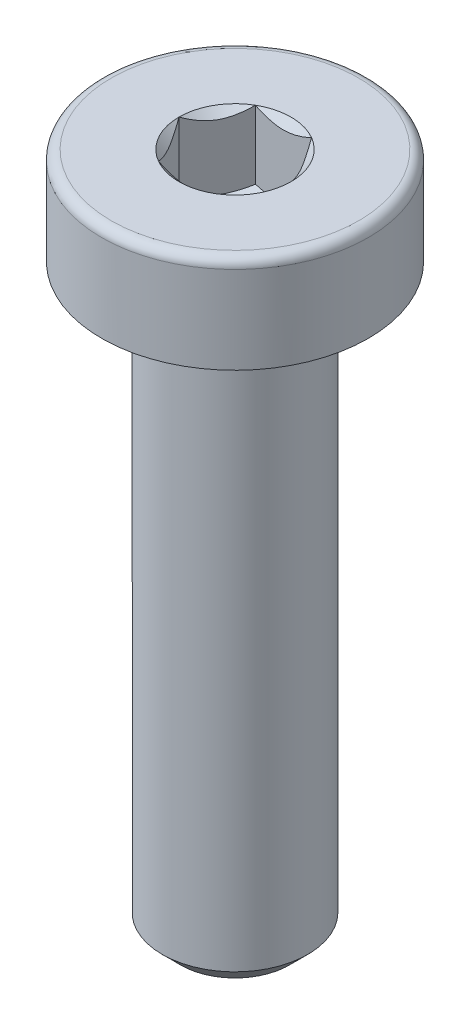
ISO-10303-21;
HEADER;
FILE_DESCRIPTION(('STEP AP214'),'2;1');
FILE_NAME('part.step','',(''),(''),'','','');
FILE_SCHEMA(('AUTOMOTIVE_DESIGN { 1 0 10303 214 1 1 1 1 }'));
ENDSEC;
DATA;
#1=APPLICATION_CONTEXT('core data for automotive mechanical design processes');
#2=APPLICATION_PROTOCOL_DEFINITION('international standard','automotive_design',2000,#1);
#3=PRODUCT_CONTEXT('',#1,'mechanical');
#4=PRODUCT('Part','Part','',(#3));
#5=PRODUCT_RELATED_PRODUCT_CATEGORY('part','',(#4));
#6=PRODUCT_DEFINITION_FORMATION('','',#4);
#7=PRODUCT_DEFINITION_CONTEXT('part definition',#1,'design');
#8=PRODUCT_DEFINITION('design','',#6,#7);
#9=PRODUCT_DEFINITION_SHAPE('','',#8);
#10=(LENGTH_UNIT() NAMED_UNIT(*) SI_UNIT(.MILLI.,.METRE.));
#11=(NAMED_UNIT(*) PLANE_ANGLE_UNIT() SI_UNIT($,.RADIAN.));
#12=(NAMED_UNIT(*) SI_UNIT($,.STERADIAN.) SOLID_ANGLE_UNIT());
#13=UNCERTAINTY_MEASURE_WITH_UNIT(LENGTH_MEASURE(1.E-05),#10,'distance_accuracy_value','');
#14=(GEOMETRIC_REPRESENTATION_CONTEXT(3) GLOBAL_UNCERTAINTY_ASSIGNED_CONTEXT((#13)) GLOBAL_UNIT_ASSIGNED_CONTEXT((#10,
#11,#12)) REPRESENTATION_CONTEXT('',''));
#15=CARTESIAN_POINT('',(0.,0.,0.));
#16=DIRECTION('',(0.,0.,1.));
#17=DIRECTION('',(1.,0.,0.));
#18=AXIS2_PLACEMENT_3D('',#15,#16,#17);
#19=CARTESIAN_POINT('',(0.,-0.2,0.));
#20=DIRECTION('',(0.,1.,0.));
#21=DIRECTION('',(0.,0.,1.));
#22=AXIS2_PLACEMENT_3D('',#19,#20,#21);
#23=TOROIDAL_SURFACE('',#22,1.7,0.2);
#24=CARTESIAN_POINT('',(0.,0.,0.));
#25=DIRECTION('',(0.,1.,0.));
#26=DIRECTION('',(0.,0.,1.));
#27=AXIS2_PLACEMENT_3D('',#24,#25,#26);
#28=CIRCLE('',#27,1.7);
#29=CARTESIAN_POINT('',(0.,0.,1.7));
#30=VERTEX_POINT('',#29);
#31=EDGE_CURVE('E420',#30,#30,#28,.T.);
#32=ORIENTED_EDGE('',*,*,#31,.F.);
#33=EDGE_LOOP('',(#32));
#34=FACE_BOUND('',#33,.T.);
#35=CARTESIAN_POINT('',(0.,-0.2,0.));
#36=DIRECTION('',(0.,-1.,0.));
#37=DIRECTION('',(0.,0.,1.));
#38=AXIS2_PLACEMENT_3D('',#35,#36,#37);
#39=CIRCLE('',#38,1.5);
#40=CARTESIAN_POINT('',(0.,-0.2,1.5));
#41=VERTEX_POINT('',#40);
#42=EDGE_CURVE('E502',#41,#41,#39,.T.);
#43=ORIENTED_EDGE('',*,*,#42,.F.);
#44=EDGE_LOOP('',(#43));
#45=FACE_BOUND('',#44,.T.);
#46=ADVANCED_FACE('F16',(#34,#45),#23,.F.);
#47=CARTESIAN_POINT('',(0.,-12.,0.));
#48=DIRECTION('',(0.,1.,0.));
#49=DIRECTION('',(1.,0.,0.));
#50=AXIS2_PLACEMENT_3D('',#47,#48,#49);
#51=PLANE('',#50);
#52=CARTESIAN_POINT('',(0.,-12.,0.));
#53=DIRECTION('',(0.,-1.,0.));
#54=DIRECTION('',(0.,0.,1.));
#55=AXIS2_PLACEMENT_3D('',#52,#53,#54);
#56=CIRCLE('',#55,1.125);
#57=CARTESIAN_POINT('',(0.,-12.,1.125));
#58=VERTEX_POINT('',#57);
#59=EDGE_CURVE('E10',#58,#58,#56,.T.);
#60=ORIENTED_EDGE('',*,*,#59,.T.);
#61=EDGE_LOOP('',(#60));
#62=FACE_BOUND('',#61,.T.);
#63=ADVANCED_FACE('F273',(#62),#51,.F.);
#64=CARTESIAN_POINT('',(0.,-12.125,0.));
#65=DIRECTION('',(0.,1.,0.));
#66=DIRECTION('',(-1.,0.,0.));
#67=AXIS2_PLACEMENT_3D('',#64,#65,#66);
#68=CONICAL_SURFACE('',#67,1.,0.785398163397448);
#69=ORIENTED_EDGE('',*,*,#59,.F.);
#70=EDGE_LOOP('',(#69));
#71=FACE_BOUND('',#70,.T.);
#72=CARTESIAN_POINT('',(0.,-11.625,0.));
#73=DIRECTION('',(0.,-1.,0.));
#74=DIRECTION('',(-1.,0.,0.));
#75=AXIS2_PLACEMENT_3D('',#72,#73,#74);
#76=CIRCLE('',#75,1.5);
#77=CARTESIAN_POINT('',(-1.5,-11.625,0.));
#78=VERTEX_POINT('',#77);
#79=EDGE_CURVE('E159',#78,#78,#76,.T.);
#80=ORIENTED_EDGE('',*,*,#79,.T.);
#81=EDGE_LOOP('',(#80));
#82=FACE_BOUND('',#81,.T.);
#83=ADVANCED_FACE('F270',(#71,#82),#68,.T.);
#84=CARTESIAN_POINT('',(-1.15470053837925,0.5,0.));
#85=DIRECTION('',(-0.866025403784439,0.,0.5));
#86=DIRECTION('',(0.,1.,0.));
#87=AXIS2_PLACEMENT_3D('',#84,#85,#86);
#88=PLANE('',#87);
#89=CARTESIAN_POINT('',(-1.15470053837925,2.,0.));
#90=CARTESIAN_POINT('',(-1.00117078125086,1.84647024287162,0.265921339820074));
#91=CARTESIAN_POINT('',(-0.867089249093141,1.84530172515184,0.498157365873931));
#92=CARTESIAN_POINT('',(-0.733215253083504,1.8441350161052,0.730033928774895));
#93=CARTESIAN_POINT('',(-0.57735026918948,1.99999999999927,1.00000000000025));
#94=B_SPLINE_CURVE_WITH_KNOTS('',2,(#89,#90,#91,#92,#93),.UNSPECIFIED.,.F.,.F.,(3,2,3),(0.,0.5,
1.),.UNSPECIFIED.);
#95=CARTESIAN_POINT('',(-1.15470053837925,2.,0.));
#96=VERTEX_POINT('',#95);
#97=CARTESIAN_POINT('',(-0.577350269189626,2.,1.));
#98=VERTEX_POINT('',#97);
#99=EDGE_CURVE('E416',#96,#98,#94,.T.);
#100=ORIENTED_EDGE('',*,*,#99,.T.);
#101=DIRECTION('',(0.,1.,0.));
#102=VECTOR('',#101,1.);
#103=CARTESIAN_POINT('',(-0.577350269189626,0.5,1.));
#104=LINE('',#103,#102);
#105=CARTESIAN_POINT('',(-0.577350269189626,0.589316397477042,1.));
#106=VERTEX_POINT('',#105);
#107=EDGE_CURVE('E143',#106,#98,#104,.T.);
#108=ORIENTED_EDGE('',*,*,#107,.F.);
#109=CARTESIAN_POINT('',(-1.15470053837925,0.589316397477043,0.));
#110=CARTESIAN_POINT('',(-1.1422776254852,0.582145061548454,0.021515887063845));
#111=CARTESIAN_POINT('',(-1.12980572440145,0.575290529962869,0.0431130815008311));
#112=CARTESIAN_POINT('',(-1.10516877386456,0.562518070323557,0.0858404042081745));
#113=CARTESIAN_POINT('',(-1.09300571707735,0.556578244850613,0.106965156736799));
#114=CARTESIAN_POINT('',(-1.06894241920652,0.545632531934319,0.148883907199831));
#115=CARTESIAN_POINT('',(-1.05704304561731,0.540607317583832,0.169673316642415));
#116=CARTESIAN_POINT('',(-1.03344126715609,0.531488117613305,0.211063578718422));
#117=CARTESIAN_POINT('',(-1.02173909837023,0.527379242171332,0.231661269176965));
#118=CARTESIAN_POINT('',(-0.998439619296902,0.520087570224119,0.272815704232481));
#119=CARTESIAN_POINT('',(-0.986842367431211,0.516896357949622,0.293370983478975));
#120=CARTESIAN_POINT('',(-0.963630649649038,0.511432897740972,0.33458880079611));
#121=CARTESIAN_POINT('',(-0.952016187375457,0.509160477291832,0.355251317992815));
#122=CARTESIAN_POINT('',(-0.928615137972573,0.505525933544308,0.396828053797181));
#123=CARTESIAN_POINT('',(-0.916827980653532,0.504172969622274,0.41774275139525));
#124=CARTESIAN_POINT('',(-0.892891053471395,0.502367479696766,0.459958305071784));
#125=CARTESIAN_POINT('',(-0.88073874884194,0.501933526563364,0.481258507610898));
#126=CARTESIAN_POINT('',(-0.856257235695783,0.501957698326459,0.523654214585648));
#127=CARTESIAN_POINT('',(-0.843928822248721,0.502412614939665,0.544750180023796));
#128=CARTESIAN_POINT('',(-0.819420681665752,0.504253995001974,0.586439287846091));
#129=CARTESIAN_POINT('',(-0.80724270276635,0.505622235893781,0.607034252182705));
#130=CARTESIAN_POINT('',(-0.783017066755103,0.509280885955065,0.647952632793485));
#131=CARTESIAN_POINT('',(-0.770969274303699,0.511562376898162,0.668276765739735));
#132=CARTESIAN_POINT('',(-0.746956492541301,0.51703779791969,0.708859066345339));
#133=CARTESIAN_POINT('',(-0.734991529583474,0.520232005852064,0.729117212014218));
#134=CARTESIAN_POINT('',(-0.711075209617807,0.527523596594688,0.769746807127452));
#135=CARTESIAN_POINT('',(-0.699125090769733,0.531629372272877,0.790117471798635));
#136=CARTESIAN_POINT('',(-0.675154824355723,0.540736433878131,0.831125976310756));
#137=CARTESIAN_POINT('',(-0.663137276162293,0.545752483880906,0.851762040669467));
#138=CARTESIAN_POINT('',(-0.638941132936142,0.556674024791821,0.893430606128303));
#139=CARTESIAN_POINT('',(-0.626766044340648,0.562598648059455,0.914460089337463));
#140=CARTESIAN_POINT('',(-0.602159683115032,0.575334898103387,0.957023431622116));
#141=CARTESIAN_POINT('',(-0.58973203881774,0.582168191432241,0.978552925679333));
#142=CARTESIAN_POINT('',(-0.57735026918962,0.589316397477036,0.999999999999998));
#143=B_SPLINE_CURVE_WITH_KNOTS('',3,(#109,#110,#111,#112,#113,#114,#115,#116,#117,#118,#119,
#120,#121,#122,#123,#124,#125,#126,#127,#128,#129,#130,#131,#132,#133,#134,#135,#136,#137,#138,
#139,#140,#141,#142),.UNSPECIFIED.,.F.,.F.,(4,2,2,2,2,2,2,2,2,2,2,2,2,2,2,2,4),(0.,
0.0775799336285172,0.15283713344211,0.226249266739255,0.298363815314992,0.369794224205565,
0.441211214882481,0.51332960442225,0.586892093802747,0.66018955743096,0.732066645944519,
0.803258313913417,0.8744716775434,0.946370107950428,1.01956032219192,1.09458388807375,
1.17191346643988),.UNSPECIFIED.);
#144=CARTESIAN_POINT('',(-1.15470053837925,0.589316397477044,0.));
#145=VERTEX_POINT('',#144);
#146=EDGE_CURVE('E139',#145,#106,#143,.T.);
#147=ORIENTED_EDGE('',*,*,#146,.F.);
#148=DIRECTION('',(0.,1.,0.));
#149=VECTOR('',#148,1.);
#150=CARTESIAN_POINT('',(-1.15470053837925,0.5,0.));
#151=LINE('',#150,#149);
#152=EDGE_CURVE('E29',#145,#96,#151,.T.);
#153=ORIENTED_EDGE('',*,*,#152,.T.);
#154=EDGE_LOOP('',(#100,#108,#147,#153));
#155=FACE_BOUND('',#154,.T.);
#156=ADVANCED_FACE('F141',(#155),#88,.F.);
#157=CARTESIAN_POINT('',(-0.577350269189624,0.5,-1.));
#158=DIRECTION('',(-0.866025403784438,0.,-0.5));
#159=DIRECTION('',(-0.5,0.,0.866025403784438));
#160=AXIS2_PLACEMENT_3D('',#157,#158,#159);
#161=PLANE('',#160);
#162=CARTESIAN_POINT('',(-0.577350269189625,2.,-0.999999999999998));
#163=CARTESIAN_POINT('',(-0.730880026318,1.84647024287162,-0.734078660179944));
#164=CARTESIAN_POINT('',(-0.864961558475733,1.84530172515184,-0.501842634126069));
#165=CARTESIAN_POINT('',(-0.998835554485382,1.8441350161052,-0.269966071225084));
#166=CARTESIAN_POINT('',(-1.15470053837939,1.99999999999928,2.43945488809238E-13));
#167=B_SPLINE_CURVE_WITH_KNOTS('',2,(#162,#163,#164,#165,#166),.UNSPECIFIED.,.F.,.F.,(3,2,3),
(0.,0.5,1.),.UNSPECIFIED.);
#168=CARTESIAN_POINT('',(-0.577350269189625,2.,-1.));
#169=VERTEX_POINT('',#168);
#170=EDGE_CURVE('E130',#169,#96,#167,.T.);
#171=ORIENTED_EDGE('',*,*,#170,.T.);
#172=ORIENTED_EDGE('',*,*,#152,.F.);
#173=CARTESIAN_POINT('',(-0.577350269189627,0.589316397477045,-1.));
#174=CARTESIAN_POINT('',(-0.589772117524805,0.582145061548479,-0.978483498312897));
#175=CARTESIAN_POINT('',(-0.602239886015797,0.575290529962917,-0.956883917922458));
#176=CARTESIAN_POINT('',(-0.626924357647565,0.562518070323645,-0.914184031532187));
#177=CARTESIAN_POINT('',(-0.639137401592391,0.556578244850719,-0.893088139102523));
#178=CARTESIAN_POINT('',(-0.663408455452852,0.54563253193445,-0.851289336616123));
#179=CARTESIAN_POINT('',(-0.675462925365203,0.540607317583974,-0.830589472077488));
#180=CARTESIAN_POINT('',(-0.699507054561722,0.53148811761346,-0.789454601317619));
#181=CARTESIAN_POINT('',(-0.711494093365185,0.527379242171491,-0.769021380640425));
#182=CARTESIAN_POINT('',(-0.735485140065021,0.520087570224278,-0.728266222340228));
#183=CARTESIAN_POINT('',(-0.747487908141538,0.516896357949778,-0.707945067987197));
#184=CARTESIAN_POINT('',(-0.771577726135665,0.511432897741115,-0.667234222063753));
#185=CARTESIAN_POINT('',(-0.783664759797369,0.509160477291966,-0.646844544085154));
#186=CARTESIAN_POINT('',(-0.807970744508966,0.505525933544416,-0.605790272924778));
#187=CARTESIAN_POINT('',(-0.820189825281854,0.504172969622366,-0.585124946448999));
#188=CARTESIAN_POINT('',(-0.844781103609498,0.502367479696817,-0.54328718258234));
#189=CARTESIAN_POINT('',(-0.857151467799394,0.501933526563389,-0.522112876789074));
#190=CARTESIAN_POINT('',(-0.881626470477781,0.501957698326439,-0.479713410994005));
#191=CARTESIAN_POINT('',(-0.89373190574098,0.50241261493962,-0.458488709041452));
#192=CARTESIAN_POINT('',(-0.917581661884609,0.504253995001887,-0.416419482786004));
#193=CARTESIAN_POINT('',(-0.929328434740412,0.505622235893679,-0.395575561524098));
#194=CARTESIAN_POINT('',(-0.952651973825387,0.509280885954937,-0.354136355010195));
#195=CARTESIAN_POINT('',(-0.964229293041011,0.511562376898024,-0.333540594214658));
#196=CARTESIAN_POINT('',(-0.987368205428263,0.517037797919539,-0.292453764890132));
#197=CARTESIAN_POINT('',(-0.998929792732163,0.52023200585191,-0.271962730178892));
#198=CARTESIAN_POINT('',(-1.02215789426288,0.527523596594534,-0.230935791966992));
#199=CARTESIAN_POINT('',(-1.03382434793608,0.531629372272727,-0.210401353130728));
#200=CARTESIAN_POINT('',(-1.05735362140782,0.540736433877994,-0.169138241224641));
#201=CARTESIAN_POINT('',(-1.06921620327991,0.54575248388078,-0.148412707018555));
#202=CARTESIAN_POINT('',(-1.09320416789351,0.55667402479172,-0.106623949581629));
#203=CARTESIAN_POINT('',(-1.10532869028339,0.562598648059372,-0.0855652719599876));
#204=CARTESIAN_POINT('',(-1.12988644535915,0.575334898103344,-0.0429738669014798));
#205=CARTESIAN_POINT('',(-1.14231771199472,0.58216819143222,-0.0214464642021553));
#206=CARTESIAN_POINT('',(-1.15470053837925,0.589316397477038,0.));
#207=B_SPLINE_CURVE_WITH_KNOTS('',3,(#173,#174,#175,#176,#177,#178,#179,#180,#181,#182,#183,
#184,#185,#186,#187,#188,#189,#190,#191,#192,#193,#194,#195,#196,#197,#198,#199,#200,#201,#202,
#203,#204,#205,#206),.UNSPECIFIED.,.F.,.F.,(4,2,2,2,2,2,2,2,2,2,2,2,2,2,2,2,4),(0.,
0.0775799336282744,0.152837133441706,0.226249266738765,0.298363815314486,0.369794224205106,
0.441211214882123,0.513329604422042,0.586892093802727,0.660189557430751,0.73206664594416,
0.803258313912957,0.874471677542892,0.946370107949937,1.01956032219152,1.09458388807351,
1.17191346643989),.UNSPECIFIED.);
#208=CARTESIAN_POINT('',(-0.577350269189625,0.589316397477047,-1.));
#209=VERTEX_POINT('',#208);
#210=EDGE_CURVE('E128',#209,#145,#207,.T.);
#211=ORIENTED_EDGE('',*,*,#210,.F.);
#212=DIRECTION('',(0.,1.,0.));
#213=VECTOR('',#212,1.);
#214=CARTESIAN_POINT('',(-0.577350269189625,0.5,-1.));
#215=LINE('',#214,#213);
#216=EDGE_CURVE('E136',#209,#169,#215,.T.);
#217=ORIENTED_EDGE('',*,*,#216,.T.);
#218=EDGE_LOOP('',(#171,#172,#211,#217));
#219=FACE_BOUND('',#218,.T.);
#220=ADVANCED_FACE('F18',(#219),#161,.F.);
#221=CARTESIAN_POINT('',(0.577350269189628,0.5,-1.));
#222=DIRECTION('',(0.,0.,-1.));
#223=DIRECTION('',(0.,-1.,0.));
#224=AXIS2_PLACEMENT_3D('',#221,#222,#223);
#225=PLANE('',#224);
#226=CARTESIAN_POINT('',(0.577350269189625,2.,-1.));
#227=CARTESIAN_POINT('',(0.270060534721078,1.84635513276574,-1.));
#228=CARTESIAN_POINT('',(0.000495609398556127,1.84529958443508,-1.));
#229=CARTESIAN_POINT('',(-0.265863448139593,1.84425658947496,-1.));
#230=CARTESIAN_POINT('',(-0.577350269189632,2.,-1.));
#231=B_SPLINE_CURVE_WITH_KNOTS('',2,(#226,#227,#228,#229,#230),.UNSPECIFIED.,.F.,.F.,(3,2,3),
(0.,0.5,1.),.UNSPECIFIED.);
#232=CARTESIAN_POINT('',(0.577350269189628,2.,-1.));
#233=VERTEX_POINT('',#232);
#234=EDGE_CURVE('E345',#233,#169,#231,.T.);
#235=ORIENTED_EDGE('',*,*,#234,.T.);
#236=ORIENTED_EDGE('',*,*,#216,.F.);
#237=CARTESIAN_POINT('',(0.577350269189629,0.589316397477046,-1.));
#238=CARTESIAN_POINT('',(0.552505507960357,0.582145061548458,-0.999999385376672));
#239=CARTESIAN_POINT('',(0.527565838385578,0.575290529962872,-0.999996999423149));
#240=CARTESIAN_POINT('',(0.47824441621688,0.56251807032356,-1.0000244357401));
#241=CARTESIAN_POINT('',(0.453868315484823,0.556578244850616,-1.00005329583901));
#242=CARTESIAN_POINT('',(0.405533963753522,0.545632531934322,-1.00017324381556));
#243=CARTESIAN_POINT('',(0.381580120251964,0.540607317583835,-1.00026278871947));
#244=CARTESIAN_POINT('',(0.333934212594235,0.531488117613308,-1.00051818003557));
#245=CARTESIAN_POINT('',(0.310245005004916,0.527379242171335,-1.00068264981691));
#246=CARTESIAN_POINT('',(0.262954479231781,0.520087570224122,-1.00108192657222));
#247=CARTESIAN_POINT('',(0.239354459289589,0.516896357949625,-1.00131605146569));
#248=CARTESIAN_POINT('',(0.192052923513318,0.511432897740975,-1.00182302285942));
#249=CARTESIAN_POINT('',(0.168351427578049,0.509160477291835,-1.00209586207756));
#250=CARTESIAN_POINT('',(0.120644393463594,0.505525933544311,-1.00261832672163));
#251=CARTESIAN_POINT('',(0.0966381553716762,0.504172969622278,-1.00286769784397));
#252=CARTESIAN_POINT('',(0.0481099498619062,0.50236747969677,-1.00324548765397));
#253=CARTESIAN_POINT('',(0.023587281042553,0.501933526563368,-1.00337138439989));
#254=CARTESIAN_POINT('',(-0.0253692347820597,0.501957698326463,-1.00336762557961));
#255=CARTESIAN_POINT('',(-0.0498030834923871,0.502412614939669,-1.00323888906517));
#256=CARTESIAN_POINT('',(-0.0981609802190884,0.504253995001978,-1.00285877063195));
#257=CARTESIAN_POINT('',(-0.122085731974333,0.505622235893786,-1.00260981370662));
#258=CARTESIAN_POINT('',(-0.169634907070614,0.509280885955069,-1.00208898780344));
#259=CARTESIAN_POINT('',(-0.193260018737662,0.511562376898166,-1.00181735995412));
#260=CARTESIAN_POINT('',(-0.240411712887332,0.517037797919695,-1.00131283123516));
#261=CARTESIAN_POINT('',(-0.26393826314906,0.520232005852068,-1.00107994219278));
#262=CARTESIAN_POINT('',(-0.31108268464543,0.527523596594693,-1.00068259909409));
#263=CARTESIAN_POINT('',(-0.334699257166686,0.531629372272882,-1.00051882492901));
#264=CARTESIAN_POINT('',(-0.382198797052396,0.540736433878136,-1.00026421753506));
#265=CARTESIAN_POINT('',(-0.406078927117886,0.545752483880911,-1.0001747476877));
#266=CARTESIAN_POINT('',(-0.454263034957568,0.556674024791826,-1.00005455570966));
#267=CARTESIAN_POINT('',(-0.478562645942905,0.56259864805946,-1.00002536129722));
#268=CARTESIAN_POINT('',(-0.527726762244194,0.575334898103392,-0.999997298523466));
#269=CARTESIAN_POINT('',(-0.552585673177015,0.582168191432246,-0.999999389881423));
#270=CARTESIAN_POINT('',(-0.577350269189624,0.589316397477041,-0.999999999999998));
#271=B_SPLINE_CURVE_WITH_KNOTS('',3,(#237,#238,#239,#240,#241,#242,#243,#244,#245,#246,#247,
#248,#249,#250,#251,#252,#253,#254,#255,#256,#257,#258,#259,#260,#261,#262,#263,#264,#265,#266,
#267,#268,#269,#270),.UNSPECIFIED.,.F.,.F.,(4,2,2,2,2,2,2,2,2,2,2,2,2,2,2,2,4),(0.,
0.0775799336285192,0.152837133442114,0.22624926673926,0.298363815314997,0.369794224205569,
0.441211214882483,0.513329604422249,0.586892093802744,0.660189557430959,0.732066645944521,
0.803258313913422,0.874471677543404,0.946370107950433,1.01956032219193,1.09458388807376,
1.17191346643988),.UNSPECIFIED.);
#272=CARTESIAN_POINT('',(0.577350269189628,0.589316397477047,-1.));
#273=VERTEX_POINT('',#272);
#274=EDGE_CURVE('E156',#273,#209,#271,.T.);
#275=ORIENTED_EDGE('',*,*,#274,.F.);
#276=DIRECTION('',(0.,1.,0.));
#277=VECTOR('',#276,1.);
#278=CARTESIAN_POINT('',(0.577350269189628,0.5,-1.));
#279=LINE('',#278,#277);
#280=EDGE_CURVE('E89',#273,#233,#279,.T.);
#281=ORIENTED_EDGE('',*,*,#280,.T.);
#282=EDGE_LOOP('',(#235,#236,#275,#281));
#283=FACE_BOUND('',#282,.T.);
#284=ADVANCED_FACE('F182',(#283),#225,.F.);
#285=CARTESIAN_POINT('',(1.15470053837925,0.5,0.));
#286=DIRECTION('',(0.866025403784439,0.,-0.5));
#287=DIRECTION('',(0.,-1.,0.));
#288=AXIS2_PLACEMENT_3D('',#285,#286,#287);
#289=PLANE('',#288);
#290=CARTESIAN_POINT('',(1.15470053837925,2.,0.));
#291=CARTESIAN_POINT('',(1.00117078125086,1.84647024287162,-0.265921339820078));
#292=CARTESIAN_POINT('',(0.867089249093142,1.84530172515184,-0.498157365873931));
#293=CARTESIAN_POINT('',(0.733215253083495,1.84413501610522,-0.730033928774914));
#294=CARTESIAN_POINT('',(0.577350269189482,1.99999999999929,-1.00000000000025));
#295=B_SPLINE_CURVE_WITH_KNOTS('',2,(#290,#291,#292,#293,#294),.UNSPECIFIED.,.F.,.F.,(3,2,3),
(0.,0.5,1.),.UNSPECIFIED.);
#296=CARTESIAN_POINT('',(1.15470053837925,2.,0.));
#297=VERTEX_POINT('',#296);
#298=EDGE_CURVE('E432',#297,#233,#295,.T.);
#299=ORIENTED_EDGE('',*,*,#298,.T.);
#300=ORIENTED_EDGE('',*,*,#280,.F.);
#301=CARTESIAN_POINT('',(1.15470053837925,0.589316397477043,0.));
#302=CARTESIAN_POINT('',(1.1422776254852,0.582145061548455,-0.0215158870638419));
#303=CARTESIAN_POINT('',(1.12980572440145,0.575290529962869,-0.0431130815008281));
#304=CARTESIAN_POINT('',(1.10516877386457,0.562518070323558,-0.0858404042081722));
#305=CARTESIAN_POINT('',(1.09300571707735,0.556578244850615,-0.106965156736797));
#306=CARTESIAN_POINT('',(1.06894241920652,0.545632531934321,-0.148883907199829));
#307=CARTESIAN_POINT('',(1.05704304561732,0.540607317583834,-0.169673316642413));
#308=CARTESIAN_POINT('',(1.03344126715609,0.531488117613307,-0.211063578718421));
#309=CARTESIAN_POINT('',(1.02173909837023,0.527379242171335,-0.231661269176964));
#310=CARTESIAN_POINT('',(0.998439619296906,0.520087570224122,-0.272815704232479));
#311=CARTESIAN_POINT('',(0.986842367431215,0.516896357949625,-0.293370983478973));
#312=CARTESIAN_POINT('',(0.963630649649042,0.511432897740975,-0.334588800796107));
#313=CARTESIAN_POINT('',(0.952016187375462,0.509160477291835,-0.355251317992812));
#314=CARTESIAN_POINT('',(0.928615137972578,0.505525933544311,-0.396828053797177));
#315=CARTESIAN_POINT('',(0.916827980653537,0.504172969622278,-0.417742751395246));
#316=CARTESIAN_POINT('',(0.892891053471401,0.50236747969677,-0.459958305071779));
#317=CARTESIAN_POINT('',(0.880738748841946,0.501933526563367,-0.481258507610893));
#318=CARTESIAN_POINT('',(0.856257235695789,0.501957698326462,-0.523654214585642));
#319=CARTESIAN_POINT('',(0.843928822248727,0.502412614939669,-0.54475018002379));
#320=CARTESIAN_POINT('',(0.819420681665758,0.504253995001977,-0.586439287846085));
#321=CARTESIAN_POINT('',(0.807242702766356,0.505622235893785,-0.6070342521827));
#322=CARTESIAN_POINT('',(0.783017066755108,0.509280885955068,-0.64795263279348));
#323=CARTESIAN_POINT('',(0.770969274303704,0.511562376898166,-0.66827676573973));
#324=CARTESIAN_POINT('',(0.746956492541306,0.517037797919694,-0.708859066345335));
#325=CARTESIAN_POINT('',(0.734991529583479,0.520232005852067,-0.729117212014214));
#326=CARTESIAN_POINT('',(0.711075209617813,0.527523596594692,-0.769746807127448));
#327=CARTESIAN_POINT('',(0.699125090769738,0.531629372272881,-0.790117471798631));
#328=CARTESIAN_POINT('',(0.675154824355728,0.540736433878135,-0.831125976310752));
#329=CARTESIAN_POINT('',(0.663137276162299,0.545752483880911,-0.851762040669464));
#330=CARTESIAN_POINT('',(0.638941132936147,0.556674024791825,-0.8934306061283));
#331=CARTESIAN_POINT('',(0.626766044340653,0.562598648059459,-0.91446008933746));
#332=CARTESIAN_POINT('',(0.602159683115038,0.575334898103392,-0.957023431622114));
#333=CARTESIAN_POINT('',(0.589732038817745,0.582168191432245,-0.978552925679331));
#334=CARTESIAN_POINT('',(0.577350269189625,0.589316397477041,-0.999999999999997));
#335=B_SPLINE_CURVE_WITH_KNOTS('',3,(#301,#302,#303,#304,#305,#306,#307,#308,#309,#310,#311,
#312,#313,#314,#315,#316,#317,#318,#319,#320,#321,#322,#323,#324,#325,#326,#327,#328,#329,#330,
#331,#332,#333,#334),.UNSPECIFIED.,.F.,.F.,(4,2,2,2,2,2,2,2,2,2,2,2,2,2,2,2,4),(0.,
0.0775799336285166,0.15283713344211,0.226249266739254,0.298363815314991,0.369794224205563,
0.441211214882478,0.513329604422245,0.586892093802741,0.660189557430954,0.732066645944514,
0.803258313913414,0.874471677543396,0.946370107950424,1.01956032219192,1.09458388807375,
1.17191346643988),.UNSPECIFIED.);
#336=CARTESIAN_POINT('',(1.15470053837925,0.589316397477045,0.));
#337=VERTEX_POINT('',#336);
#338=EDGE_CURVE('E405',#337,#273,#335,.T.);
#339=ORIENTED_EDGE('',*,*,#338,.F.);
#340=DIRECTION('',(0.,1.,0.));
#341=VECTOR('',#340,1.);
#342=CARTESIAN_POINT('',(1.15470053837925,0.5,0.));
#343=LINE('',#342,#341);
#344=EDGE_CURVE('E104',#337,#297,#343,.T.);
#345=ORIENTED_EDGE('',*,*,#344,.T.);
#346=EDGE_LOOP('',(#299,#300,#339,#345));
#347=FACE_BOUND('',#346,.T.);
#348=ADVANCED_FACE('F381',(#347),#289,.F.);
#349=CARTESIAN_POINT('',(0.577350269189626,0.5,1.));
#350=DIRECTION('',(0.866025403784439,0.,0.5));
#351=DIRECTION('',(0.,-1.,0.));
#352=AXIS2_PLACEMENT_3D('',#349,#350,#351);
#353=PLANE('',#352);
#354=CARTESIAN_POINT('',(0.577350269189625,2.,1.));
#355=CARTESIAN_POINT('',(0.730880026318006,1.84647024287162,0.734078660179936));
#356=CARTESIAN_POINT('',(0.864961558475735,1.84530172515183,0.501842634126069));
#357=CARTESIAN_POINT('',(0.998835554485375,1.8441350161052,0.269966071225099));
#358=CARTESIAN_POINT('',(1.1547005383794,1.99999999999928,-2.51968584885631E-13));
#359=B_SPLINE_CURVE_WITH_KNOTS('',2,(#354,#355,#356,#357,#358),.UNSPECIFIED.,.F.,.F.,(3,2,3),
(0.,0.5,1.),.UNSPECIFIED.);
#360=CARTESIAN_POINT('',(0.577350269189626,2.,1.));
#361=VERTEX_POINT('',#360);
#362=EDGE_CURVE('E315',#361,#297,#359,.T.);
#363=ORIENTED_EDGE('',*,*,#362,.T.);
#364=ORIENTED_EDGE('',*,*,#344,.F.);
#365=CARTESIAN_POINT('',(0.577350269189629,0.589316397477041,1.));
#366=CARTESIAN_POINT('',(0.589772117524845,0.582145061548453,0.97848349831283));
#367=CARTESIAN_POINT('',(0.602239886015871,0.575290529962867,0.95688391792232));
#368=CARTESIAN_POINT('',(0.626924357647685,0.562518070323555,0.914184031531926));
#369=CARTESIAN_POINT('',(0.639137401592525,0.556578244850612,0.893088139102211));
#370=CARTESIAN_POINT('',(0.663408455452999,0.545632531934318,0.851289336615727));
#371=CARTESIAN_POINT('',(0.675462925365349,0.540607317583831,0.83058947207706));
#372=CARTESIAN_POINT('',(0.699507054561857,0.531488117613304,0.789454601317146));
#373=CARTESIAN_POINT('',(0.71149409336531,0.527379242171332,0.769021380639941));
#374=CARTESIAN_POINT('',(0.735485140065122,0.520087570224119,0.728266222339741));
#375=CARTESIAN_POINT('',(0.747487908141624,0.516896357949621,0.70794506798672));
#376=CARTESIAN_POINT('',(0.771577726135722,0.511432897740971,0.667234222063315));
#377=CARTESIAN_POINT('',(0.783664759797411,0.509160477291832,0.646844544084746));
#378=CARTESIAN_POINT('',(0.807970744508983,0.505525933544308,0.605790272924451));
#379=CARTESIAN_POINT('',(0.82018982528186,0.504172969622274,0.585124946448723));
#380=CARTESIAN_POINT('',(0.844781103609495,0.502367479696766,0.543287182582189));
#381=CARTESIAN_POINT('',(0.857151467799393,0.501933526563364,0.522112876788997));
#382=CARTESIAN_POINT('',(0.881626470477849,0.501957698326459,0.479713410993967));
#383=CARTESIAN_POINT('',(0.893731905741113,0.502412614939665,0.458488709041379));
#384=CARTESIAN_POINT('',(0.917581661884845,0.504253995001974,0.41641948278586));
#385=CARTESIAN_POINT('',(0.929328434740686,0.505622235893782,0.395575561523919));
#386=CARTESIAN_POINT('',(0.952651973825719,0.509280885955065,0.354136355009953));
#387=CARTESIAN_POINT('',(0.964229293041362,0.511562376898163,0.333540594214389));
#388=CARTESIAN_POINT('',(0.987368205428633,0.517037797919691,0.292453764889818));
#389=CARTESIAN_POINT('',(0.998929792732534,0.520232005852065,0.27196273017856));
#390=CARTESIAN_POINT('',(1.02215789426324,0.527523596594689,0.230935791966639));
#391=CARTESIAN_POINT('',(1.03382434793642,0.531629372272878,0.210401353130372));
#392=CARTESIAN_POINT('',(1.05735362140812,0.540736433878132,0.169138241224298));
#393=CARTESIAN_POINT('',(1.06921620328018,0.545752483880908,0.148412707018228));
#394=CARTESIAN_POINT('',(1.09320416789371,0.556674024791822,0.106623949581356));
#395=CARTESIAN_POINT('',(1.10532869028355,0.562598648059457,0.0855652719597518));
#396=CARTESIAN_POINT('',(1.12988644535923,0.575334898103389,0.0429738669013457));
#397=CARTESIAN_POINT('',(1.14231771199476,0.582168191432243,0.0214464642020851));
#398=CARTESIAN_POINT('',(1.15470053837925,0.589316397477038,0.));
#399=B_SPLINE_CURVE_WITH_KNOTS('',3,(#365,#366,#367,#368,#369,#370,#371,#372,#373,#374,#375,
#376,#377,#378,#379,#380,#381,#382,#383,#384,#385,#386,#387,#388,#389,#390,#391,#392,#393,#394,
#395,#396,#397,#398),.UNSPECIFIED.,.F.,.F.,(4,2,2,2,2,2,2,2,2,2,2,2,2,2,2,2,4),(0.,
0.077579933628518,0.152837133442112,0.226249266739257,0.298363815314994,0.369794224205567,
0.441211214882482,0.51332960442225,0.586892093802747,0.66018955743096,0.73206664594452,
0.803258313913421,0.874471677543402,0.946370107950432,1.01956032219193,1.09458388807376,
1.17191346643989),.UNSPECIFIED.);
#400=CARTESIAN_POINT('',(0.577350269189626,0.589316397477042,1.));
#401=VERTEX_POINT('',#400);
#402=EDGE_CURVE('E400',#401,#337,#399,.T.);
#403=ORIENTED_EDGE('',*,*,#402,.F.);
#404=DIRECTION('',(0.,1.,0.));
#405=VECTOR('',#404,1.);
#406=CARTESIAN_POINT('',(0.577350269189626,0.5,1.));
#407=LINE('',#406,#405);
#408=EDGE_CURVE('E308',#401,#361,#407,.T.);
#409=ORIENTED_EDGE('',*,*,#408,.T.);
#410=EDGE_LOOP('',(#363,#364,#403,#409));
#411=FACE_BOUND('',#410,.T.);
#412=ADVANCED_FACE('F230',(#411),#353,.F.);
#413=CARTESIAN_POINT('',(-0.577350269189626,0.5,1.));
#414=DIRECTION('',(0.,0.,1.));
#415=DIRECTION('',(1.,0.,0.));
#416=AXIS2_PLACEMENT_3D('',#413,#414,#415);
#417=PLANE('',#416);
#418=CARTESIAN_POINT('',(-0.577350269189628,2.,1.));
#419=CARTESIAN_POINT('',(-0.270060534721116,1.84635513276573,1.));
#420=CARTESIAN_POINT('',(-0.000495609398554068,1.84529958443507,1.));
#421=CARTESIAN_POINT('',(0.265863448139567,1.84425658947493,1.));
#422=CARTESIAN_POINT('',(0.57735026918964,1.99999999999998,1.));
#423=B_SPLINE_CURVE_WITH_KNOTS('',2,(#418,#419,#420,#421,#422),.UNSPECIFIED.,.F.,.F.,(3,2,3),
(0.,0.5,1.),.UNSPECIFIED.);
#424=EDGE_CURVE('E253',#98,#361,#423,.T.);
#425=ORIENTED_EDGE('',*,*,#424,.T.);
#426=ORIENTED_EDGE('',*,*,#408,.F.);
#427=CARTESIAN_POINT('',(-0.577350269189634,0.589316397477041,1.));
#428=CARTESIAN_POINT('',(-0.552509188921581,0.582146146644213,0.999999410681156));
#429=CARTESIAN_POINT('',(-0.527573353009553,0.575292164970257,0.999996135236956));
#430=CARTESIAN_POINT('',(-0.478262590823696,0.562520705055407,1.00002065921441));
#431=CARTESIAN_POINT('',(-0.45389333238665,0.556581270665785,1.00004752759492));
#432=CARTESIAN_POINT('',(-0.405575701958643,0.5456362325618,1.00016301057745));
#433=CARTESIAN_POINT('',(-0.381631756886763,0.540611223406213,1.00025008725702));
#434=CARTESIAN_POINT('',(-0.334008732251698,0.531492358652863,1.00050074817186));
#435=CARTESIAN_POINT('',(-0.310332529781074,0.527383513863851,1.00066294226553));
#436=CARTESIAN_POINT('',(-0.263071166817641,0.520091829669054,1.00105851823854));
#437=CARTESIAN_POINT('',(-0.239487323334236,0.516900458315821,1.00129119992797));
#438=CARTESIAN_POINT('',(-0.19222135952883,0.511436682987336,1.00179693290733));
#439=CARTESIAN_POINT('',(-0.168539273688525,0.509163980275795,1.0020699710345));
#440=CARTESIAN_POINT('',(-0.120968666616696,0.505535844377386,1.0025937905998));
#441=CARTESIAN_POINT('',(-0.097079738975184,0.504185725886581,1.00284443596971));
#442=CARTESIAN_POINT('',(-0.0487943254453937,0.50237955978456,1.00323031944072));
#443=CARTESIAN_POINT('',(-0.0243971484261165,0.501941729168259,1.00336317618692));
#444=CARTESIAN_POINT('',(0.0245592809649892,0.501949118408598,1.00337596948335));
#445=CARTESIAN_POINT('',(0.0491185329555203,0.502400225959888,1.00325421937165));
#446=CARTESIAN_POINT('',(0.0977190298961206,0.504241049569115,1.00288221391613));
#447=CARTESIAN_POINT('',(0.121760989080045,0.505612186958667,1.00263452525113));
#448=CARTESIAN_POINT('',(0.169446515997906,0.509277290512429,1.00211501192311));
#449=CARTESIAN_POINT('',(0.193091067612033,0.511558499995219,1.00184355979864));
#450=CARTESIAN_POINT('',(0.240278393979013,0.517033608967552,1.0013377544029));
#451=CARTESIAN_POINT('',(0.263821151096014,0.520227660643859,1.00110340732782));
#452=CARTESIAN_POINT('',(0.310994796933776,0.527519245895964,1.00070233954299));
#453=CARTESIAN_POINT('',(0.334624405661577,0.531625056684866,1.00053628092839));
#454=CARTESIAN_POINT('',(0.382146891751851,0.540732463711396,1.00027693006104));
#455=CARTESIAN_POINT('',(0.406036952270331,0.545748725056203,1.00018498786931));
#456=CARTESIAN_POINT('',(0.45423784681058,0.556670954462461,1.00006032566276));
#457=CARTESIAN_POINT('',(0.478544333409609,0.562595976573044,1.00002913833069));
#458=CARTESIAN_POINT('',(0.527719177888323,0.575333243627362,0.999998162712414));
#459=CARTESIAN_POINT('',(0.552581957340031,0.582167096471653,0.999999364873642));
#460=CARTESIAN_POINT('',(0.577350269189627,0.589316397477037,0.999999999999995));
#461=B_SPLINE_CURVE_WITH_KNOTS('',3,(#427,#428,#429,#430,#431,#432,#433,#434,#435,#436,#437,
#438,#439,#440,#441,#442,#443,#444,#445,#446,#447,#448,#449,#450,#451,#452,#453,#454,#455,#456,
#457,#458,#459,#460),.UNSPECIFIED.,.F.,.F.,(4,2,2,2,2,2,2,2,2,2,2,2,2,2,2,2,4),(0.,
0.0775684310572642,0.152805430459757,0.226188371943068,0.298264435464577,0.36964678461188,
0.441005902655604,0.512772707290909,0.585959365421267,0.659632389354974,0.731860756072294,
0.803110382730178,0.874371894883563,0.94630890322294,1.01952840696414,1.09457227613251,
1.17191346564551),.UNSPECIFIED.);
#462=EDGE_CURVE('E149',#106,#401,#461,.T.);
#463=ORIENTED_EDGE('',*,*,#462,.F.);
#464=ORIENTED_EDGE('',*,*,#107,.T.);
#465=EDGE_LOOP('',(#425,#426,#463,#464));
#466=FACE_BOUND('',#465,.T.);
#467=ADVANCED_FACE('F220',(#466),#417,.F.);
#468=CARTESIAN_POINT('',(0.,2.,0.));
#469=DIRECTION('',(0.,1.,0.));
#470=DIRECTION('',(0.,0.,1.));
#471=AXIS2_PLACEMENT_3D('',#468,#469,#470);
#472=CONICAL_SURFACE('',#471,1.15470053837925,0.785398163397448);
#473=ORIENTED_EDGE('',*,*,#99,.F.);
#474=CARTESIAN_POINT('',(0.,2.,0.));
#475=DIRECTION('',(0.,-1.,0.));
#476=DIRECTION('',(-1.,0.,0.));
#477=AXIS2_PLACEMENT_3D('',#474,#475,#476);
#478=CIRCLE('',#477,1.15470053837925);
#479=EDGE_CURVE('E291',#98,#96,#478,.T.);
#480=ORIENTED_EDGE('',*,*,#479,.F.);
#481=EDGE_LOOP('',(#473,#480));
#482=FACE_BOUND('',#481,.T.);
#483=ADVANCED_FACE('F229',(#482),#472,.F.);
#484=CARTESIAN_POINT('',(0.,1.8,0.));
#485=DIRECTION('',(0.,1.,0.));
#486=DIRECTION('',(0.,0.,1.));
#487=AXIS2_PLACEMENT_3D('',#484,#485,#486);
#488=TOROIDAL_SURFACE('',#487,2.55,0.2);
#489=CARTESIAN_POINT('',(0.,2.,0.));
#490=DIRECTION('',(0.,1.,0.));
#491=DIRECTION('',(0.,0.,1.));
#492=AXIS2_PLACEMENT_3D('',#489,#490,#491);
#493=CIRCLE('',#492,2.55);
#494=CARTESIAN_POINT('',(0.,2.,2.55));
#495=VERTEX_POINT('',#494);
#496=EDGE_CURVE('E295',#495,#495,#493,.T.);
#497=ORIENTED_EDGE('',*,*,#496,.F.);
#498=EDGE_LOOP('',(#497));
#499=FACE_BOUND('',#498,.T.);
#500=CARTESIAN_POINT('',(0.,1.8,0.));
#501=DIRECTION('',(0.,-1.,0.));
#502=DIRECTION('',(0.,0.,1.));
#503=AXIS2_PLACEMENT_3D('',#500,#501,#502);
#504=CIRCLE('',#503,2.75);
#505=CARTESIAN_POINT('',(0.,1.8,2.75));
#506=VERTEX_POINT('',#505);
#507=EDGE_CURVE('E303',#506,#506,#504,.T.);
#508=ORIENTED_EDGE('',*,*,#507,.F.);
#509=EDGE_LOOP('',(#508));
#510=FACE_BOUND('',#509,.T.);
#511=ADVANCED_FACE('F265',(#499,#510),#488,.T.);
#512=CARTESIAN_POINT('',(0.,0.,0.));
#513=DIRECTION('',(0.,1.,0.));
#514=DIRECTION('',(1.,0.,0.));
#515=AXIS2_PLACEMENT_3D('',#512,#513,#514);
#516=PLANE('',#515);
#517=CARTESIAN_POINT('',(0.,0.,0.));
#518=DIRECTION('',(0.,1.,0.));
#519=DIRECTION('',(1.,0.,0.));
#520=AXIS2_PLACEMENT_3D('',#517,#518,#519);
#521=CIRCLE('',#520,2.75);
#522=CARTESIAN_POINT('',(2.75,0.,0.));
#523=VERTEX_POINT('',#522);
#524=EDGE_CURVE('E296',#523,#523,#521,.T.);
#525=ORIENTED_EDGE('',*,*,#524,.F.);
#526=EDGE_LOOP('',(#525));
#527=FACE_BOUND('',#526,.T.);
#528=ORIENTED_EDGE('',*,*,#31,.T.);
#529=EDGE_LOOP('',(#528));
#530=FACE_BOUND('',#529,.T.);
#531=ADVANCED_FACE('F268',(#527,#530),#516,.F.);
#532=CARTESIAN_POINT('',(0.,2.,0.));
#533=DIRECTION('',(0.,1.,0.));
#534=DIRECTION('',(1.,0.,0.));
#535=AXIS2_PLACEMENT_3D('',#532,#533,#534);
#536=PLANE('',#535);
#537=ORIENTED_EDGE('',*,*,#496,.T.);
#538=EDGE_LOOP('',(#537));
#539=FACE_BOUND('',#538,.T.);
#540=CARTESIAN_POINT('',(0.,2.,0.));
#541=DIRECTION('',(0.,-1.,0.));
#542=DIRECTION('',(-1.,0.,0.));
#543=AXIS2_PLACEMENT_3D('',#540,#541,#542);
#544=CIRCLE('',#543,1.15470053837925);
#545=EDGE_CURVE('E299',#96,#169,#544,.T.);
#546=ORIENTED_EDGE('',*,*,#545,.T.);
#547=CARTESIAN_POINT('',(0.,2.,0.));
#548=DIRECTION('',(0.,-1.,0.));
#549=DIRECTION('',(-1.,0.,0.));
#550=AXIS2_PLACEMENT_3D('',#547,#548,#549);
#551=CIRCLE('',#550,1.15470053837925);
#552=EDGE_CURVE('E342',#169,#233,#551,.T.);
#553=ORIENTED_EDGE('',*,*,#552,.T.);
#554=CARTESIAN_POINT('',(0.,2.,0.));
#555=DIRECTION('',(0.,-1.,0.));
#556=DIRECTION('',(-1.,0.,0.));
#557=AXIS2_PLACEMENT_3D('',#554,#555,#556);
#558=CIRCLE('',#557,1.15470053837925);
#559=EDGE_CURVE('E427',#233,#297,#558,.T.);
#560=ORIENTED_EDGE('',*,*,#559,.T.);
#561=CARTESIAN_POINT('',(0.,2.,0.));
#562=DIRECTION('',(0.,-1.,0.));
#563=DIRECTION('',(-1.,0.,0.));
#564=AXIS2_PLACEMENT_3D('',#561,#562,#563);
#565=CIRCLE('',#564,1.15470053837925);
#566=EDGE_CURVE('E425',#297,#361,#565,.T.);
#567=ORIENTED_EDGE('',*,*,#566,.T.);
#568=CARTESIAN_POINT('',(0.,2.,0.));
#569=DIRECTION('',(0.,-1.,0.));
#570=DIRECTION('',(-1.,0.,0.));
#571=AXIS2_PLACEMENT_3D('',#568,#569,#570);
#572=CIRCLE('',#571,1.15470053837925);
#573=EDGE_CURVE('E311',#361,#98,#572,.T.);
#574=ORIENTED_EDGE('',*,*,#573,.T.);
#575=ORIENTED_EDGE('',*,*,#479,.T.);
#576=EDGE_LOOP('',(#546,#553,#560,#567,#574,#575));
#577=FACE_BOUND('',#576,.T.);
#578=ADVANCED_FACE('F232',(#539,#577),#536,.T.);
#579=CARTESIAN_POINT('',(0.,2.,0.));
#580=DIRECTION('',(0.,-1.,0.));
#581=DIRECTION('',(0.,0.,-1.));
#582=AXIS2_PLACEMENT_3D('',#579,#580,#581);
#583=CYLINDRICAL_SURFACE('',#582,2.75);
#584=ORIENTED_EDGE('',*,*,#524,.T.);
#585=EDGE_LOOP('',(#584));
#586=FACE_BOUND('',#585,.T.);
#587=ORIENTED_EDGE('',*,*,#507,.T.);
#588=EDGE_LOOP('',(#587));
#589=FACE_BOUND('',#588,.T.);
#590=ADVANCED_FACE('F383',(#586,#589),#583,.T.);
#591=CARTESIAN_POINT('',(0.,2.,0.));
#592=DIRECTION('',(0.,1.,0.));
#593=DIRECTION('',(0.,0.,1.));
#594=AXIS2_PLACEMENT_3D('',#591,#592,#593);
#595=CONICAL_SURFACE('',#594,1.15470053837925,0.785398163397448);
#596=ORIENTED_EDGE('',*,*,#170,.F.);
#597=ORIENTED_EDGE('',*,*,#545,.F.);
#598=EDGE_LOOP('',(#596,#597));
#599=FACE_BOUND('',#598,.T.);
#600=ADVANCED_FACE('F179',(#599),#595,.F.);
#601=CARTESIAN_POINT('',(0.,2.,0.));
#602=DIRECTION('',(0.,1.,0.));
#603=DIRECTION('',(0.,0.,1.));
#604=AXIS2_PLACEMENT_3D('',#601,#602,#603);
#605=CONICAL_SURFACE('',#604,1.15470053837925,0.785398163397448);
#606=ORIENTED_EDGE('',*,*,#234,.F.);
#607=ORIENTED_EDGE('',*,*,#552,.F.);
#608=EDGE_LOOP('',(#606,#607));
#609=FACE_BOUND('',#608,.T.);
#610=ADVANCED_FACE('F366',(#609),#605,.F.);
#611=CARTESIAN_POINT('',(0.,2.,0.));
#612=DIRECTION('',(0.,1.,0.));
#613=DIRECTION('',(0.,0.,1.));
#614=AXIS2_PLACEMENT_3D('',#611,#612,#613);
#615=CONICAL_SURFACE('',#614,1.15470053837925,0.785398163397448);
#616=ORIENTED_EDGE('',*,*,#298,.F.);
#617=ORIENTED_EDGE('',*,*,#559,.F.);
#618=EDGE_LOOP('',(#616,#617));
#619=FACE_BOUND('',#618,.T.);
#620=ADVANCED_FACE('F376',(#619),#615,.F.);
#621=CARTESIAN_POINT('',(0.,2.,0.));
#622=DIRECTION('',(0.,1.,0.));
#623=DIRECTION('',(0.,0.,1.));
#624=AXIS2_PLACEMENT_3D('',#621,#622,#623);
#625=CONICAL_SURFACE('',#624,1.15470053837925,0.785398163397448);
#626=ORIENTED_EDGE('',*,*,#362,.F.);
#627=ORIENTED_EDGE('',*,*,#566,.F.);
#628=EDGE_LOOP('',(#626,#627));
#629=FACE_BOUND('',#628,.T.);
#630=ADVANCED_FACE('F264',(#629),#625,.F.);
#631=CARTESIAN_POINT('',(0.,2.,0.));
#632=DIRECTION('',(0.,1.,0.));
#633=DIRECTION('',(0.,0.,1.));
#634=AXIS2_PLACEMENT_3D('',#631,#632,#633);
#635=CONICAL_SURFACE('',#634,1.15470053837925,0.785398163397448);
#636=ORIENTED_EDGE('',*,*,#424,.F.);
#637=ORIENTED_EDGE('',*,*,#573,.F.);
#638=EDGE_LOOP('',(#636,#637));
#639=FACE_BOUND('',#638,.T.);
#640=ADVANCED_FACE('F177',(#639),#635,.F.);
#641=CARTESIAN_POINT('',(0.,0.5,0.));
#642=DIRECTION('',(0.,1.,0.));
#643=DIRECTION('',(0.,0.,1.));
#644=AXIS2_PLACEMENT_3D('',#641,#642,#643);
#645=CONICAL_SURFACE('',#644,1.,1.0471975511966);
#646=CARTESIAN_POINT('',(0.,-0.0773502691896258,0.));
#647=VERTEX_POINT('',#646);
#648=VERTEX_LOOP('',#647);
#649=FACE_BOUND('',#648,.T.);
#650=ORIENTED_EDGE('',*,*,#210,.T.);
#651=ORIENTED_EDGE('',*,*,#146,.T.);
#652=ORIENTED_EDGE('',*,*,#462,.T.);
#653=ORIENTED_EDGE('',*,*,#402,.T.);
#654=ORIENTED_EDGE('',*,*,#338,.T.);
#655=ORIENTED_EDGE('',*,*,#274,.T.);
#656=EDGE_LOOP('',(#650,#651,#652,#653,#654,#655));
#657=FACE_BOUND('',#656,.T.);
#658=ADVANCED_FACE('F154',(#649,#657),#645,.F.);
#659=CARTESIAN_POINT('',(0.,-12.,0.));
#660=DIRECTION('',(0.,1.,0.));
#661=DIRECTION('',(0.,0.,1.));
#662=AXIS2_PLACEMENT_3D('',#659,#660,#661);
#663=CYLINDRICAL_SURFACE('',#662,1.5);
#664=ORIENTED_EDGE('',*,*,#79,.F.);
#665=EDGE_LOOP('',(#664));
#666=FACE_BOUND('',#665,.T.);
#667=ORIENTED_EDGE('',*,*,#42,.T.);
#668=EDGE_LOOP('',(#667));
#669=FACE_BOUND('',#668,.T.);
#670=ADVANCED_FACE('F176',(#666,#669),#663,.T.);
#671=CLOSED_SHELL('',(#46,#63,#83,#156,#220,#284,#348,#412,#467,#483,#511,#531,#578,#590,#600,
#610,#620,#630,#640,#658,#670));
#672=MANIFOLD_SOLID_BREP('B1',#671);
#673=ADVANCED_BREP_SHAPE_REPRESENTATION('',(#18,#672),#14);
#674=SHAPE_DEFINITION_REPRESENTATION(#9,#673);
ENDSEC;
END-ISO-10303-21;
